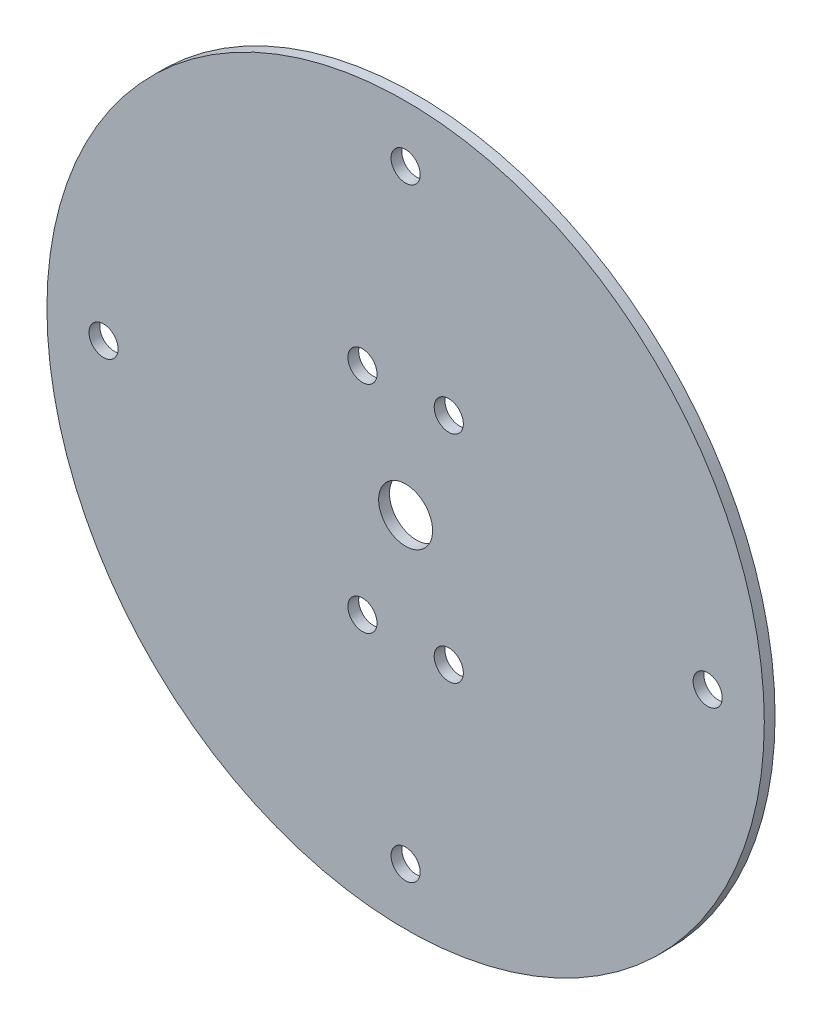
ISO-10303-21;
HEADER;
FILE_DESCRIPTION(('STEP AP214'),'2;1');
FILE_NAME('part.step','',(''),(''),'','','');
FILE_SCHEMA(('AUTOMOTIVE_DESIGN { 1 0 10303 214 1 1 1 1 }'));
ENDSEC;
DATA;
#1=APPLICATION_CONTEXT('core data for automotive mechanical design processes');
#2=APPLICATION_PROTOCOL_DEFINITION('international standard','automotive_design',2000,#1);
#3=PRODUCT_CONTEXT('',#1,'mechanical');
#4=PRODUCT('Part','Part','',(#3));
#5=PRODUCT_RELATED_PRODUCT_CATEGORY('part','',(#4));
#6=PRODUCT_DEFINITION_FORMATION('','',#4);
#7=PRODUCT_DEFINITION_CONTEXT('part definition',#1,'design');
#8=PRODUCT_DEFINITION('design','',#6,#7);
#9=PRODUCT_DEFINITION_SHAPE('','',#8);
#10=(LENGTH_UNIT() NAMED_UNIT(*) SI_UNIT(.MILLI.,.METRE.));
#11=(NAMED_UNIT(*) PLANE_ANGLE_UNIT() SI_UNIT($,.RADIAN.));
#12=(NAMED_UNIT(*) SI_UNIT($,.STERADIAN.) SOLID_ANGLE_UNIT());
#13=UNCERTAINTY_MEASURE_WITH_UNIT(LENGTH_MEASURE(1.E-05),#10,'distance_accuracy_value','');
#14=(GEOMETRIC_REPRESENTATION_CONTEXT(3) GLOBAL_UNCERTAINTY_ASSIGNED_CONTEXT((#13)) GLOBAL_UNIT_ASSIGNED_CONTEXT((#10,
#11,#12)) REPRESENTATION_CONTEXT('',''));
#15=CARTESIAN_POINT('',(0.,0.,0.));
#16=DIRECTION('',(0.,0.,1.));
#17=DIRECTION('',(1.,0.,0.));
#18=AXIS2_PLACEMENT_3D('',#15,#16,#17);
#19=CARTESIAN_POINT('',(0.,0.,2.54));
#20=DIRECTION('',(0.,0.,-1.));
#21=DIRECTION('',(-1.,0.,0.));
#22=AXIS2_PLACEMENT_3D('',#19,#20,#21);
#23=CYLINDRICAL_SURFACE('',#22,84.455);
#24=CARTESIAN_POINT('',(0.,0.,2.54));
#25=DIRECTION('',(0.,0.,1.));
#26=DIRECTION('',(1.,0.,0.));
#27=AXIS2_PLACEMENT_3D('',#24,#25,#26);
#28=CIRCLE('',#27,84.455);
#29=CARTESIAN_POINT('',(84.455,0.,2.54));
#30=VERTEX_POINT('',#29);
#31=EDGE_CURVE('E10',#30,#30,#28,.T.);
#32=ORIENTED_EDGE('',*,*,#31,.F.);
#33=EDGE_LOOP('',(#32));
#34=FACE_BOUND('',#33,.T.);
#35=CARTESIAN_POINT('',(0.,0.,0.));
#36=DIRECTION('',(0.,0.,1.));
#37=DIRECTION('',(1.,0.,0.));
#38=AXIS2_PLACEMENT_3D('',#35,#36,#37);
#39=CIRCLE('',#38,84.455);
#40=CARTESIAN_POINT('',(84.455,0.,0.));
#41=VERTEX_POINT('',#40);
#42=EDGE_CURVE('E45',#41,#41,#39,.T.);
#43=ORIENTED_EDGE('',*,*,#42,.T.);
#44=EDGE_LOOP('',(#43));
#45=FACE_BOUND('',#44,.T.);
#46=ADVANCED_FACE('F42',(#34,#45),#23,.T.);
#47=CARTESIAN_POINT('',(0.,0.,2.54));
#48=DIRECTION('',(0.,0.,1.));
#49=DIRECTION('',(1.,0.,0.));
#50=AXIS2_PLACEMENT_3D('',#47,#48,#49);
#51=PLANE('',#50);
#52=CARTESIAN_POINT('',(2.48314152818524E-13,-71.12,2.54));
#53=DIRECTION('',(0.,0.,-1.));
#54=DIRECTION('',(0.,-1.,0.));
#55=AXIS2_PLACEMENT_3D('',#52,#53,#54);
#56=CIRCLE('',#55,3.429);
#57=CARTESIAN_POINT('',(2.60286442329417E-13,-74.549,2.54));
#58=VERTEX_POINT('',#57);
#59=EDGE_CURVE('E87',#58,#58,#56,.T.);
#60=ORIENTED_EDGE('',*,*,#59,.T.);
#61=EDGE_LOOP('',(#60));
#62=FACE_BOUND('',#61,.T.);
#63=CARTESIAN_POINT('',(71.12,0.,2.54));
#64=DIRECTION('',(0.,0.,-1.));
#65=DIRECTION('',(1.,0.,0.));
#66=AXIS2_PLACEMENT_3D('',#63,#64,#65);
#67=CIRCLE('',#66,3.429);
#68=CARTESIAN_POINT('',(74.549,0.,2.54));
#69=VERTEX_POINT('',#68);
#70=EDGE_CURVE('E99',#69,#69,#67,.T.);
#71=ORIENTED_EDGE('',*,*,#70,.T.);
#72=EDGE_LOOP('',(#71));
#73=FACE_BOUND('',#72,.T.);
#74=CARTESIAN_POINT('',(-7.44942458455571E-13,71.12,2.54));
#75=DIRECTION('',(0.,0.,-1.));
#76=DIRECTION('',(0.,1.,0.));
#77=AXIS2_PLACEMENT_3D('',#74,#75,#76);
#78=CIRCLE('',#77,3.429);
#79=CARTESIAN_POINT('',(-7.8085932698825E-13,74.549,2.54));
#80=VERTEX_POINT('',#79);
#81=EDGE_CURVE('E93',#80,#80,#78,.T.);
#82=ORIENTED_EDGE('',*,*,#81,.T.);
#83=EDGE_LOOP('',(#82));
#84=FACE_BOUND('',#83,.T.);
#85=CARTESIAN_POINT('',(-71.12,0.,2.54));
#86=DIRECTION('',(0.,0.,-1.));
#87=DIRECTION('',(-1.,0.,0.));
#88=AXIS2_PLACEMENT_3D('',#85,#86,#87);
#89=CIRCLE('',#88,3.429);
#90=CARTESIAN_POINT('',(-74.549,0.,2.54));
#91=VERTEX_POINT('',#90);
#92=EDGE_CURVE('E81',#91,#91,#89,.T.);
#93=ORIENTED_EDGE('',*,*,#92,.T.);
#94=EDGE_LOOP('',(#93));
#95=FACE_BOUND('',#94,.T.);
#96=CARTESIAN_POINT('',(0.,0.,2.54));
#97=DIRECTION('',(0.,0.,1.));
#98=DIRECTION('',(1.,0.,0.));
#99=AXIS2_PLACEMENT_3D('',#96,#97,#98);
#100=CIRCLE('',#99,6.35);
#101=CARTESIAN_POINT('',(6.35,0.,2.54));
#102=VERTEX_POINT('',#101);
#103=EDGE_CURVE('E78',#102,#102,#100,.T.);
#104=ORIENTED_EDGE('',*,*,#103,.F.);
#105=EDGE_LOOP('',(#104));
#106=FACE_BOUND('',#105,.T.);
#107=CARTESIAN_POINT('',(-10.16,-25.4,2.54));
#108=DIRECTION('',(0.,0.,1.));
#109=DIRECTION('',(-1.,0.,0.));
#110=AXIS2_PLACEMENT_3D('',#107,#108,#109);
#111=CIRCLE('',#110,3.429);
#112=CARTESIAN_POINT('',(-13.589,-25.4,2.54));
#113=VERTEX_POINT('',#112);
#114=EDGE_CURVE('E63',#113,#113,#111,.T.);
#115=ORIENTED_EDGE('',*,*,#114,.F.);
#116=EDGE_LOOP('',(#115));
#117=FACE_BOUND('',#116,.T.);
#118=CARTESIAN_POINT('',(10.16,-25.4,2.54));
#119=DIRECTION('',(0.,0.,1.));
#120=DIRECTION('',(1.,0.,0.));
#121=AXIS2_PLACEMENT_3D('',#118,#119,#120);
#122=CIRCLE('',#121,3.429);
#123=CARTESIAN_POINT('',(13.589,-25.4,2.54));
#124=VERTEX_POINT('',#123);
#125=EDGE_CURVE('E70',#124,#124,#122,.T.);
#126=ORIENTED_EDGE('',*,*,#125,.F.);
#127=EDGE_LOOP('',(#126));
#128=FACE_BOUND('',#127,.T.);
#129=CARTESIAN_POINT('',(10.16,25.4,2.54));
#130=DIRECTION('',(0.,0.,1.));
#131=DIRECTION('',(-1.,0.,0.));
#132=AXIS2_PLACEMENT_3D('',#129,#130,#131);
#133=CIRCLE('',#132,3.429);
#134=CARTESIAN_POINT('',(6.731,25.4,2.54));
#135=VERTEX_POINT('',#134);
#136=EDGE_CURVE('E57',#135,#135,#133,.T.);
#137=ORIENTED_EDGE('',*,*,#136,.F.);
#138=EDGE_LOOP('',(#137));
#139=FACE_BOUND('',#138,.T.);
#140=CARTESIAN_POINT('',(-10.16,25.4,2.54));
#141=DIRECTION('',(0.,0.,1.));
#142=DIRECTION('',(1.,0.,0.));
#143=AXIS2_PLACEMENT_3D('',#140,#141,#142);
#144=CIRCLE('',#143,3.429);
#145=CARTESIAN_POINT('',(-6.731,25.4,2.54));
#146=VERTEX_POINT('',#145);
#147=EDGE_CURVE('E54',#146,#146,#144,.T.);
#148=ORIENTED_EDGE('',*,*,#147,.F.);
#149=EDGE_LOOP('',(#148));
#150=FACE_BOUND('',#149,.T.);
#151=ORIENTED_EDGE('',*,*,#31,.T.);
#152=EDGE_LOOP('',(#151));
#153=FACE_BOUND('',#152,.T.);
#154=ADVANCED_FACE('F108',(#62,#73,#84,#95,#106,#117,#128,#139,#150,#153),#51,.T.);
#155=CARTESIAN_POINT('',(0.,0.,0.));
#156=DIRECTION('',(0.,0.,1.));
#157=DIRECTION('',(1.,0.,0.));
#158=AXIS2_PLACEMENT_3D('',#155,#156,#157);
#159=PLANE('',#158);
#160=CARTESIAN_POINT('',(2.48314152818524E-13,-71.12,0.));
#161=DIRECTION('',(0.,0.,-1.));
#162=DIRECTION('',(0.,-1.,0.));
#163=AXIS2_PLACEMENT_3D('',#160,#161,#162);
#164=CIRCLE('',#163,3.429);
#165=CARTESIAN_POINT('',(2.60286442329417E-13,-74.549,0.));
#166=VERTEX_POINT('',#165);
#167=EDGE_CURVE('E102',#166,#166,#164,.T.);
#168=ORIENTED_EDGE('',*,*,#167,.F.);
#169=EDGE_LOOP('',(#168));
#170=FACE_BOUND('',#169,.T.);
#171=CARTESIAN_POINT('',(71.12,0.,0.));
#172=DIRECTION('',(0.,0.,-1.));
#173=DIRECTION('',(1.,0.,0.));
#174=AXIS2_PLACEMENT_3D('',#171,#172,#173);
#175=CIRCLE('',#174,3.429);
#176=CARTESIAN_POINT('',(74.549,0.,0.));
#177=VERTEX_POINT('',#176);
#178=EDGE_CURVE('E96',#177,#177,#175,.T.);
#179=ORIENTED_EDGE('',*,*,#178,.F.);
#180=EDGE_LOOP('',(#179));
#181=FACE_BOUND('',#180,.T.);
#182=CARTESIAN_POINT('',(-7.44942458455571E-13,71.12,0.));
#183=DIRECTION('',(0.,0.,-1.));
#184=DIRECTION('',(0.,1.,0.));
#185=AXIS2_PLACEMENT_3D('',#182,#183,#184);
#186=CIRCLE('',#185,3.429);
#187=CARTESIAN_POINT('',(-7.8085932698825E-13,74.549,0.));
#188=VERTEX_POINT('',#187);
#189=EDGE_CURVE('E90',#188,#188,#186,.T.);
#190=ORIENTED_EDGE('',*,*,#189,.F.);
#191=EDGE_LOOP('',(#190));
#192=FACE_BOUND('',#191,.T.);
#193=CARTESIAN_POINT('',(-71.12,0.,0.));
#194=DIRECTION('',(0.,0.,-1.));
#195=DIRECTION('',(-1.,0.,0.));
#196=AXIS2_PLACEMENT_3D('',#193,#194,#195);
#197=CIRCLE('',#196,3.429);
#198=CARTESIAN_POINT('',(-74.549,0.,0.));
#199=VERTEX_POINT('',#198);
#200=EDGE_CURVE('E84',#199,#199,#197,.T.);
#201=ORIENTED_EDGE('',*,*,#200,.F.);
#202=EDGE_LOOP('',(#201));
#203=FACE_BOUND('',#202,.T.);
#204=CARTESIAN_POINT('',(0.,0.,0.));
#205=DIRECTION('',(0.,0.,1.));
#206=DIRECTION('',(1.,0.,0.));
#207=AXIS2_PLACEMENT_3D('',#204,#205,#206);
#208=CIRCLE('',#207,6.35);
#209=CARTESIAN_POINT('',(6.35,0.,0.));
#210=VERTEX_POINT('',#209);
#211=EDGE_CURVE('E64',#210,#210,#208,.T.);
#212=ORIENTED_EDGE('',*,*,#211,.T.);
#213=EDGE_LOOP('',(#212));
#214=FACE_BOUND('',#213,.T.);
#215=CARTESIAN_POINT('',(-10.16,-25.4,0.));
#216=DIRECTION('',(0.,0.,1.));
#217=DIRECTION('',(-1.,0.,0.));
#218=AXIS2_PLACEMENT_3D('',#215,#216,#217);
#219=CIRCLE('',#218,3.429);
#220=CARTESIAN_POINT('',(-13.589,-25.4,0.));
#221=VERTEX_POINT('',#220);
#222=EDGE_CURVE('E60',#221,#221,#219,.T.);
#223=ORIENTED_EDGE('',*,*,#222,.T.);
#224=EDGE_LOOP('',(#223));
#225=FACE_BOUND('',#224,.T.);
#226=CARTESIAN_POINT('',(10.16,-25.4,0.));
#227=DIRECTION('',(0.,0.,1.));
#228=DIRECTION('',(1.,0.,0.));
#229=AXIS2_PLACEMENT_3D('',#226,#227,#228);
#230=CIRCLE('',#229,3.429);
#231=CARTESIAN_POINT('',(13.589,-25.4,0.));
#232=VERTEX_POINT('',#231);
#233=EDGE_CURVE('E67',#232,#232,#230,.T.);
#234=ORIENTED_EDGE('',*,*,#233,.T.);
#235=EDGE_LOOP('',(#234));
#236=FACE_BOUND('',#235,.T.);
#237=CARTESIAN_POINT('',(10.16,25.4,0.));
#238=DIRECTION('',(0.,0.,1.));
#239=DIRECTION('',(-1.,0.,0.));
#240=AXIS2_PLACEMENT_3D('',#237,#238,#239);
#241=CIRCLE('',#240,3.429);
#242=CARTESIAN_POINT('',(6.731,25.4,0.));
#243=VERTEX_POINT('',#242);
#244=EDGE_CURVE('E73',#243,#243,#241,.T.);
#245=ORIENTED_EDGE('',*,*,#244,.T.);
#246=EDGE_LOOP('',(#245));
#247=FACE_BOUND('',#246,.T.);
#248=CARTESIAN_POINT('',(-10.16,25.4,0.));
#249=DIRECTION('',(0.,0.,1.));
#250=DIRECTION('',(1.,0.,0.));
#251=AXIS2_PLACEMENT_3D('',#248,#249,#250);
#252=CIRCLE('',#251,3.429);
#253=CARTESIAN_POINT('',(-6.731,25.4,0.));
#254=VERTEX_POINT('',#253);
#255=EDGE_CURVE('E52',#254,#254,#252,.T.);
#256=ORIENTED_EDGE('',*,*,#255,.T.);
#257=EDGE_LOOP('',(#256));
#258=FACE_BOUND('',#257,.T.);
#259=ORIENTED_EDGE('',*,*,#42,.F.);
#260=EDGE_LOOP('',(#259));
#261=FACE_BOUND('',#260,.T.);
#262=ADVANCED_FACE('F118',(#170,#181,#192,#203,#214,#225,#236,#247,#258,#261),#159,.F.);
#263=CARTESIAN_POINT('',(-10.16,25.4,0.));
#264=DIRECTION('',(0.,0.,1.));
#265=DIRECTION('',(1.,0.,0.));
#266=AXIS2_PLACEMENT_3D('',#263,#264,#265);
#267=CYLINDRICAL_SURFACE('',#266,3.429);
#268=ORIENTED_EDGE('',*,*,#255,.F.);
#269=EDGE_LOOP('',(#268));
#270=FACE_BOUND('',#269,.T.);
#271=ORIENTED_EDGE('',*,*,#147,.T.);
#272=EDGE_LOOP('',(#271));
#273=FACE_BOUND('',#272,.T.);
#274=ADVANCED_FACE('F121',(#270,#273),#267,.F.);
#275=CARTESIAN_POINT('',(10.16,25.4,0.));
#276=DIRECTION('',(0.,0.,1.));
#277=DIRECTION('',(1.,0.,0.));
#278=AXIS2_PLACEMENT_3D('',#275,#276,#277);
#279=CYLINDRICAL_SURFACE('',#278,3.429);
#280=ORIENTED_EDGE('',*,*,#244,.F.);
#281=EDGE_LOOP('',(#280));
#282=FACE_BOUND('',#281,.T.);
#283=ORIENTED_EDGE('',*,*,#136,.T.);
#284=EDGE_LOOP('',(#283));
#285=FACE_BOUND('',#284,.T.);
#286=ADVANCED_FACE('F152',(#282,#285),#279,.F.);
#287=CARTESIAN_POINT('',(10.16,-25.4,0.));
#288=DIRECTION('',(0.,0.,1.));
#289=DIRECTION('',(1.,0.,0.));
#290=AXIS2_PLACEMENT_3D('',#287,#288,#289);
#291=CYLINDRICAL_SURFACE('',#290,3.429);
#292=ORIENTED_EDGE('',*,*,#233,.F.);
#293=EDGE_LOOP('',(#292));
#294=FACE_BOUND('',#293,.T.);
#295=ORIENTED_EDGE('',*,*,#125,.T.);
#296=EDGE_LOOP('',(#295));
#297=FACE_BOUND('',#296,.T.);
#298=ADVANCED_FACE('F158',(#294,#297),#291,.F.);
#299=CARTESIAN_POINT('',(-10.16,-25.4,0.));
#300=DIRECTION('',(0.,0.,1.));
#301=DIRECTION('',(1.,0.,0.));
#302=AXIS2_PLACEMENT_3D('',#299,#300,#301);
#303=CYLINDRICAL_SURFACE('',#302,3.429);
#304=ORIENTED_EDGE('',*,*,#222,.F.);
#305=EDGE_LOOP('',(#304));
#306=FACE_BOUND('',#305,.T.);
#307=ORIENTED_EDGE('',*,*,#114,.T.);
#308=EDGE_LOOP('',(#307));
#309=FACE_BOUND('',#308,.T.);
#310=ADVANCED_FACE('F154',(#306,#309),#303,.F.);
#311=CARTESIAN_POINT('',(0.,0.,0.));
#312=DIRECTION('',(0.,0.,1.));
#313=DIRECTION('',(1.,0.,0.));
#314=AXIS2_PLACEMENT_3D('',#311,#312,#313);
#315=CYLINDRICAL_SURFACE('',#314,6.35);
#316=ORIENTED_EDGE('',*,*,#211,.F.);
#317=EDGE_LOOP('',(#316));
#318=FACE_BOUND('',#317,.T.);
#319=ORIENTED_EDGE('',*,*,#103,.T.);
#320=EDGE_LOOP('',(#319));
#321=FACE_BOUND('',#320,.T.);
#322=ADVANCED_FACE('F157',(#318,#321),#315,.F.);
#323=CARTESIAN_POINT('',(-71.12,0.,2.54));
#324=DIRECTION('',(0.,0.,-1.));
#325=DIRECTION('',(-1.,0.,0.));
#326=AXIS2_PLACEMENT_3D('',#323,#324,#325);
#327=CYLINDRICAL_SURFACE('',#326,3.429);
#328=ORIENTED_EDGE('',*,*,#92,.F.);
#329=EDGE_LOOP('',(#328));
#330=FACE_BOUND('',#329,.T.);
#331=ORIENTED_EDGE('',*,*,#200,.T.);
#332=EDGE_LOOP('',(#331));
#333=FACE_BOUND('',#332,.T.);
#334=ADVANCED_FACE('F168',(#330,#333),#327,.F.);
#335=CARTESIAN_POINT('',(-7.44942458455571E-13,71.12,2.54));
#336=DIRECTION('',(0.,0.,-1.));
#337=DIRECTION('',(-1.,0.,0.));
#338=AXIS2_PLACEMENT_3D('',#335,#336,#337);
#339=CYLINDRICAL_SURFACE('',#338,3.429);
#340=ORIENTED_EDGE('',*,*,#81,.F.);
#341=EDGE_LOOP('',(#340));
#342=FACE_BOUND('',#341,.T.);
#343=ORIENTED_EDGE('',*,*,#189,.T.);
#344=EDGE_LOOP('',(#343));
#345=FACE_BOUND('',#344,.T.);
#346=ADVANCED_FACE('F171',(#342,#345),#339,.F.);
#347=CARTESIAN_POINT('',(71.12,0.,2.54));
#348=DIRECTION('',(0.,0.,-1.));
#349=DIRECTION('',(-1.,0.,0.));
#350=AXIS2_PLACEMENT_3D('',#347,#348,#349);
#351=CYLINDRICAL_SURFACE('',#350,3.429);
#352=ORIENTED_EDGE('',*,*,#70,.F.);
#353=EDGE_LOOP('',(#352));
#354=FACE_BOUND('',#353,.T.);
#355=ORIENTED_EDGE('',*,*,#178,.T.);
#356=EDGE_LOOP('',(#355));
#357=FACE_BOUND('',#356,.T.);
#358=ADVANCED_FACE('F114',(#354,#357),#351,.F.);
#359=CARTESIAN_POINT('',(2.48314152818524E-13,-71.12,2.54));
#360=DIRECTION('',(0.,0.,-1.));
#361=DIRECTION('',(-1.,0.,0.));
#362=AXIS2_PLACEMENT_3D('',#359,#360,#361);
#363=CYLINDRICAL_SURFACE('',#362,3.429);
#364=ORIENTED_EDGE('',*,*,#59,.F.);
#365=EDGE_LOOP('',(#364));
#366=FACE_BOUND('',#365,.T.);
#367=ORIENTED_EDGE('',*,*,#167,.T.);
#368=EDGE_LOOP('',(#367));
#369=FACE_BOUND('',#368,.T.);
#370=ADVANCED_FACE('F111',(#366,#369),#363,.F.);
#371=CLOSED_SHELL('',(#46,#154,#262,#274,#286,#298,#310,#322,#334,#346,#358,#370));
#372=MANIFOLD_SOLID_BREP('B2',#371);
#373=ADVANCED_BREP_SHAPE_REPRESENTATION('',(#18,#372),#14);
#374=SHAPE_DEFINITION_REPRESENTATION(#9,#373);
ENDSEC;
END-ISO-10303-21;
